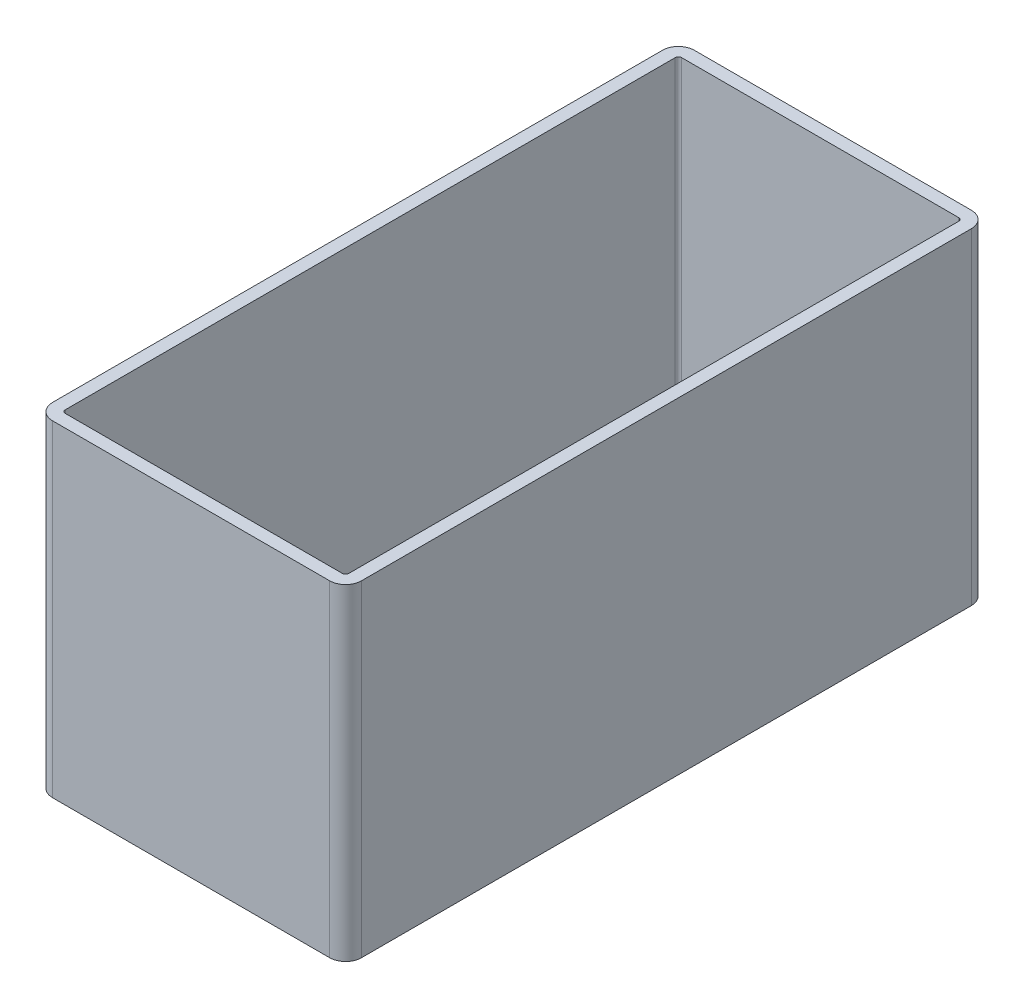
ISO-10303-21;
HEADER;
FILE_DESCRIPTION(('STEP AP214'),'2;1');
FILE_NAME('part.step','',(''),(''),'','','');
FILE_SCHEMA(('AUTOMOTIVE_DESIGN { 1 0 10303 214 1 1 1 1 }'));
ENDSEC;
DATA;
#1=APPLICATION_CONTEXT('core data for automotive mechanical design processes');
#2=APPLICATION_PROTOCOL_DEFINITION('international standard','automotive_design',2000,#1);
#3=PRODUCT_CONTEXT('',#1,'mechanical');
#4=PRODUCT('Part','Part','',(#3));
#5=PRODUCT_RELATED_PRODUCT_CATEGORY('part','',(#4));
#6=PRODUCT_DEFINITION_FORMATION('','',#4);
#7=PRODUCT_DEFINITION_CONTEXT('part definition',#1,'design');
#8=PRODUCT_DEFINITION('design','',#6,#7);
#9=PRODUCT_DEFINITION_SHAPE('','',#8);
#10=(LENGTH_UNIT() NAMED_UNIT(*) SI_UNIT(.MILLI.,.METRE.));
#11=(NAMED_UNIT(*) PLANE_ANGLE_UNIT() SI_UNIT($,.RADIAN.));
#12=(NAMED_UNIT(*) SI_UNIT($,.STERADIAN.) SOLID_ANGLE_UNIT());
#13=UNCERTAINTY_MEASURE_WITH_UNIT(LENGTH_MEASURE(1.E-05),#10,'distance_accuracy_value','');
#14=(GEOMETRIC_REPRESENTATION_CONTEXT(3) GLOBAL_UNCERTAINTY_ASSIGNED_CONTEXT((#13)) GLOBAL_UNIT_ASSIGNED_CONTEXT((#10,
#11,#12)) REPRESENTATION_CONTEXT('',''));
#15=CARTESIAN_POINT('',(0.,0.,0.));
#16=DIRECTION('',(0.,0.,1.));
#17=DIRECTION('',(1.,0.,0.));
#18=AXIS2_PLACEMENT_3D('',#15,#16,#17);
#19=CARTESIAN_POINT('',(9.7,10.25,-20.15));
#20=DIRECTION('',(-1.,0.,0.));
#21=DIRECTION('',(0.,0.,1.));
#22=AXIS2_PLACEMENT_3D('',#19,#20,#21);
#23=PLANE('',#22);
#24=DIRECTION('',(0.,0.,-1.));
#25=VECTOR('',#24,1.);
#26=CARTESIAN_POINT('',(9.7,-10.25,-20.15));
#27=LINE('',#26,#25);
#28=CARTESIAN_POINT('',(9.7,-10.25,19.15));
#29=VERTEX_POINT('',#28);
#30=CARTESIAN_POINT('',(9.7,-10.25,-19.15));
#31=VERTEX_POINT('',#30);
#32=EDGE_CURVE('E202',#29,#31,#27,.T.);
#33=ORIENTED_EDGE('',*,*,#32,.T.);
#34=DIRECTION('',(0.,-1.,0.));
#35=VECTOR('',#34,1.);
#36=CARTESIAN_POINT('',(9.7,10.25,-19.15));
#37=LINE('',#36,#35);
#38=CARTESIAN_POINT('',(9.7,10.25,-19.15));
#39=VERTEX_POINT('',#38);
#40=EDGE_CURVE('E266',#31,#39,#37,.F.);
#41=ORIENTED_EDGE('',*,*,#40,.T.);
#42=DIRECTION('',(0.,0.,-1.));
#43=VECTOR('',#42,1.);
#44=CARTESIAN_POINT('',(9.7,10.25,-20.15));
#45=LINE('',#44,#43);
#46=CARTESIAN_POINT('',(9.7,10.25,19.15));
#47=VERTEX_POINT('',#46);
#48=EDGE_CURVE('E214',#47,#39,#45,.T.);
#49=ORIENTED_EDGE('',*,*,#48,.F.);
#50=DIRECTION('',(0.,-1.,0.));
#51=VECTOR('',#50,1.);
#52=CARTESIAN_POINT('',(9.7,10.25,19.15));
#53=LINE('',#52,#51);
#54=EDGE_CURVE('E263',#47,#29,#53,.T.);
#55=ORIENTED_EDGE('',*,*,#54,.T.);
#56=EDGE_LOOP('',(#33,#41,#49,#55));
#57=FACE_BOUND('',#56,.T.);
#58=ADVANCED_FACE('F33',(#57),#23,.F.);
#59=CARTESIAN_POINT('',(-9.7,10.25,-20.15));
#60=DIRECTION('',(0.,0.,1.));
#61=DIRECTION('',(1.,0.,0.));
#62=AXIS2_PLACEMENT_3D('',#59,#60,#61);
#63=PLANE('',#62);
#64=DIRECTION('',(-1.,0.,0.));
#65=VECTOR('',#64,1.);
#66=CARTESIAN_POINT('',(-9.7,-10.25,-20.15));
#67=LINE('',#66,#65);
#68=CARTESIAN_POINT('',(8.7,-10.25,-20.15));
#69=VERTEX_POINT('',#68);
#70=CARTESIAN_POINT('',(-8.7,-10.25,-20.15));
#71=VERTEX_POINT('',#70);
#72=EDGE_CURVE('E230',#69,#71,#67,.T.);
#73=ORIENTED_EDGE('',*,*,#72,.T.);
#74=DIRECTION('',(0.,-1.,0.));
#75=VECTOR('',#74,1.);
#76=CARTESIAN_POINT('',(-8.7,10.25,-20.15));
#77=LINE('',#76,#75);
#78=CARTESIAN_POINT('',(-8.7,10.25,-20.15));
#79=VERTEX_POINT('',#78);
#80=EDGE_CURVE('E253',#71,#79,#77,.F.);
#81=ORIENTED_EDGE('',*,*,#80,.T.);
#82=DIRECTION('',(-1.,0.,0.));
#83=VECTOR('',#82,1.);
#84=CARTESIAN_POINT('',(-9.7,10.25,-20.15));
#85=LINE('',#84,#83);
#86=CARTESIAN_POINT('',(8.7,10.25,-20.15));
#87=VERTEX_POINT('',#86);
#88=EDGE_CURVE('E217',#87,#79,#85,.T.);
#89=ORIENTED_EDGE('',*,*,#88,.F.);
#90=DIRECTION('',(0.,-1.,0.));
#91=VECTOR('',#90,1.);
#92=CARTESIAN_POINT('',(8.7,10.25,-20.15));
#93=LINE('',#92,#91);
#94=EDGE_CURVE('E250',#87,#69,#93,.T.);
#95=ORIENTED_EDGE('',*,*,#94,.T.);
#96=EDGE_LOOP('',(#73,#81,#89,#95));
#97=FACE_BOUND('',#96,.T.);
#98=ADVANCED_FACE('F294',(#97),#63,.F.);
#99=CARTESIAN_POINT('',(-9.7,10.25,-20.15));
#100=DIRECTION('',(1.,0.,0.));
#101=DIRECTION('',(0.,0.,-1.));
#102=AXIS2_PLACEMENT_3D('',#99,#100,#101);
#103=PLANE('',#102);
#104=DIRECTION('',(0.,0.,1.));
#105=VECTOR('',#104,1.);
#106=CARTESIAN_POINT('',(-9.7,10.25,-20.15));
#107=LINE('',#106,#105);
#108=CARTESIAN_POINT('',(-9.7,10.25,-19.15));
#109=VERTEX_POINT('',#108);
#110=CARTESIAN_POINT('',(-9.69999999999999,10.25,19.15));
#111=VERTEX_POINT('',#110);
#112=EDGE_CURVE('E221',#109,#111,#107,.T.);
#113=ORIENTED_EDGE('',*,*,#112,.F.);
#114=DIRECTION('',(0.,-1.,0.));
#115=VECTOR('',#114,1.);
#116=CARTESIAN_POINT('',(-9.7,10.25,-19.15));
#117=LINE('',#116,#115);
#118=CARTESIAN_POINT('',(-9.7,-10.25,-19.15));
#119=VERTEX_POINT('',#118);
#120=EDGE_CURVE('E239',#109,#119,#117,.T.);
#121=ORIENTED_EDGE('',*,*,#120,.T.);
#122=DIRECTION('',(0.,0.,1.));
#123=VECTOR('',#122,1.);
#124=CARTESIAN_POINT('',(-9.7,-10.25,-20.15));
#125=LINE('',#124,#123);
#126=CARTESIAN_POINT('',(-9.69999999999999,-10.25,19.15));
#127=VERTEX_POINT('',#126);
#128=EDGE_CURVE('E233',#119,#127,#125,.T.);
#129=ORIENTED_EDGE('',*,*,#128,.T.);
#130=DIRECTION('',(0.,-1.,0.));
#131=VECTOR('',#130,1.);
#132=CARTESIAN_POINT('',(-9.69999999999999,10.25,19.15));
#133=LINE('',#132,#131);
#134=EDGE_CURVE('E227',#127,#111,#133,.F.);
#135=ORIENTED_EDGE('',*,*,#134,.T.);
#136=EDGE_LOOP('',(#113,#121,#129,#135));
#137=FACE_BOUND('',#136,.T.);
#138=ADVANCED_FACE('F302',(#137),#103,.F.);
#139=CARTESIAN_POINT('',(-9.69999999999999,10.25,20.15));
#140=DIRECTION('',(0.,0.,-1.));
#141=DIRECTION('',(-1.,0.,0.));
#142=AXIS2_PLACEMENT_3D('',#139,#140,#141);
#143=PLANE('',#142);
#144=DIRECTION('',(1.,0.,0.));
#145=VECTOR('',#144,1.);
#146=CARTESIAN_POINT('',(-9.69999999999999,-10.25,20.15));
#147=LINE('',#146,#145);
#148=CARTESIAN_POINT('',(-8.69999999999999,-10.25,20.15));
#149=VERTEX_POINT('',#148);
#150=CARTESIAN_POINT('',(8.7,-10.25,20.15));
#151=VERTEX_POINT('',#150);
#152=EDGE_CURVE('E218',#149,#151,#147,.T.);
#153=ORIENTED_EDGE('',*,*,#152,.T.);
#154=DIRECTION('',(0.,-1.,0.));
#155=VECTOR('',#154,1.);
#156=CARTESIAN_POINT('',(8.7,10.25,20.15));
#157=LINE('',#156,#155);
#158=CARTESIAN_POINT('',(8.7,10.25,20.15));
#159=VERTEX_POINT('',#158);
#160=EDGE_CURVE('E11',#151,#159,#157,.F.);
#161=ORIENTED_EDGE('',*,*,#160,.T.);
#162=DIRECTION('',(1.,0.,0.));
#163=VECTOR('',#162,1.);
#164=CARTESIAN_POINT('',(-9.69999999999999,10.25,20.15));
#165=LINE('',#164,#163);
#166=CARTESIAN_POINT('',(-8.69999999999999,10.25,20.15));
#167=VERTEX_POINT('',#166);
#168=EDGE_CURVE('E224',#167,#159,#165,.T.);
#169=ORIENTED_EDGE('',*,*,#168,.F.);
#170=DIRECTION('',(0.,-1.,0.));
#171=VECTOR('',#170,1.);
#172=CARTESIAN_POINT('',(-8.69999999999999,10.25,20.15));
#173=LINE('',#172,#171);
#174=EDGE_CURVE('E41',#167,#149,#173,.T.);
#175=ORIENTED_EDGE('',*,*,#174,.T.);
#176=EDGE_LOOP('',(#153,#161,#169,#175));
#177=FACE_BOUND('',#176,.T.);
#178=ADVANCED_FACE('F272',(#177),#143,.F.);
#179=CARTESIAN_POINT('',(0.,10.25,0.));
#180=DIRECTION('',(0.,1.,0.));
#181=DIRECTION('',(0.,0.,1.));
#182=AXIS2_PLACEMENT_3D('',#179,#180,#181);
#183=PLANE('',#182);
#184=CARTESIAN_POINT('',(8.7,10.25,-19.15));
#185=DIRECTION('',(0.,1.,0.));
#186=DIRECTION('',(0.,0.,1.));
#187=AXIS2_PLACEMENT_3D('',#184,#185,#186);
#188=CIRCLE('',#187,0.200000000000003);
#189=CARTESIAN_POINT('',(8.9,10.25,-19.15));
#190=VERTEX_POINT('',#189);
#191=CARTESIAN_POINT('',(8.7,10.25,-19.35));
#192=VERTEX_POINT('',#191);
#193=EDGE_CURVE('E48',#190,#192,#188,.T.);
#194=ORIENTED_EDGE('',*,*,#193,.F.);
#195=DIRECTION('',(0.,0.,-1.));
#196=VECTOR('',#195,1.);
#197=CARTESIAN_POINT('',(8.9,10.25,19.15));
#198=LINE('',#197,#196);
#199=CARTESIAN_POINT('',(8.90000000000001,10.25,19.15));
#200=VERTEX_POINT('',#199);
#201=EDGE_CURVE('E164',#200,#190,#198,.T.);
#202=ORIENTED_EDGE('',*,*,#201,.F.);
#203=CARTESIAN_POINT('',(8.7,10.25,19.15));
#204=DIRECTION('',(0.,1.,0.));
#205=DIRECTION('',(0.,0.,1.));
#206=AXIS2_PLACEMENT_3D('',#203,#204,#205);
#207=CIRCLE('',#206,0.200000000000001);
#208=CARTESIAN_POINT('',(8.7,10.25,19.35));
#209=VERTEX_POINT('',#208);
#210=EDGE_CURVE('E167',#209,#200,#207,.T.);
#211=ORIENTED_EDGE('',*,*,#210,.F.);
#212=DIRECTION('',(1.,0.,0.));
#213=VECTOR('',#212,1.);
#214=CARTESIAN_POINT('',(-8.69999999999999,10.25,19.35));
#215=LINE('',#214,#213);
#216=CARTESIAN_POINT('',(-8.69999999999999,10.25,19.35));
#217=VERTEX_POINT('',#216);
#218=EDGE_CURVE('E195',#217,#209,#215,.T.);
#219=ORIENTED_EDGE('',*,*,#218,.F.);
#220=CARTESIAN_POINT('',(-8.69999999999999,10.25,19.15));
#221=DIRECTION('',(0.,1.,0.));
#222=DIRECTION('',(0.,0.,1.));
#223=AXIS2_PLACEMENT_3D('',#220,#221,#222);
#224=CIRCLE('',#223,0.200000000000001);
#225=CARTESIAN_POINT('',(-8.89999999999999,10.25,19.15));
#226=VERTEX_POINT('',#225);
#227=EDGE_CURVE('E192',#226,#217,#224,.T.);
#228=ORIENTED_EDGE('',*,*,#227,.F.);
#229=DIRECTION('',(0.,0.,1.));
#230=VECTOR('',#229,1.);
#231=CARTESIAN_POINT('',(-8.9,10.25,-19.15));
#232=LINE('',#231,#230);
#233=CARTESIAN_POINT('',(-8.9,10.25,-19.15));
#234=VERTEX_POINT('',#233);
#235=EDGE_CURVE('E189',#234,#226,#232,.T.);
#236=ORIENTED_EDGE('',*,*,#235,.F.);
#237=CARTESIAN_POINT('',(-8.7,10.25,-19.15));
#238=DIRECTION('',(0.,1.,0.));
#239=DIRECTION('',(0.,0.,1.));
#240=AXIS2_PLACEMENT_3D('',#237,#238,#239);
#241=CIRCLE('',#240,0.2);
#242=CARTESIAN_POINT('',(-8.7,10.25,-19.35));
#243=VERTEX_POINT('',#242);
#244=EDGE_CURVE('E186',#243,#234,#241,.T.);
#245=ORIENTED_EDGE('',*,*,#244,.F.);
#246=DIRECTION('',(-1.,0.,0.));
#247=VECTOR('',#246,1.);
#248=CARTESIAN_POINT('',(8.7,10.25,-19.35));
#249=LINE('',#248,#247);
#250=EDGE_CURVE('E184',#192,#243,#249,.T.);
#251=ORIENTED_EDGE('',*,*,#250,.F.);
#252=EDGE_LOOP('',(#194,#202,#211,#219,#228,#236,#245,#251));
#253=FACE_BOUND('',#252,.T.);
#254=ORIENTED_EDGE('',*,*,#88,.T.);
#255=CARTESIAN_POINT('',(-8.7,10.25,-19.15));
#256=DIRECTION('',(0.,1.,0.));
#257=DIRECTION('',(0.,0.,1.));
#258=AXIS2_PLACEMENT_3D('',#255,#256,#257);
#259=CIRCLE('',#258,1.);
#260=EDGE_CURVE('E261',#79,#109,#259,.T.);
#261=ORIENTED_EDGE('',*,*,#260,.T.);
#262=ORIENTED_EDGE('',*,*,#112,.T.);
#263=CARTESIAN_POINT('',(-8.69999999999999,10.25,19.15));
#264=DIRECTION('',(0.,1.,0.));
#265=DIRECTION('',(0.,0.,1.));
#266=AXIS2_PLACEMENT_3D('',#263,#264,#265);
#267=CIRCLE('',#266,1.);
#268=EDGE_CURVE('E255',#111,#167,#267,.T.);
#269=ORIENTED_EDGE('',*,*,#268,.T.);
#270=ORIENTED_EDGE('',*,*,#168,.T.);
#271=CARTESIAN_POINT('',(8.7,10.25,19.15));
#272=DIRECTION('',(0.,1.,0.));
#273=DIRECTION('',(0.,0.,1.));
#274=AXIS2_PLACEMENT_3D('',#271,#272,#273);
#275=CIRCLE('',#274,1.);
#276=EDGE_CURVE('E257',#159,#47,#275,.T.);
#277=ORIENTED_EDGE('',*,*,#276,.T.);
#278=ORIENTED_EDGE('',*,*,#48,.T.);
#279=CARTESIAN_POINT('',(8.7,10.25,-19.15));
#280=DIRECTION('',(0.,1.,0.));
#281=DIRECTION('',(0.,0.,1.));
#282=AXIS2_PLACEMENT_3D('',#279,#280,#281);
#283=CIRCLE('',#282,1.);
#284=EDGE_CURVE('E259',#39,#87,#283,.T.);
#285=ORIENTED_EDGE('',*,*,#284,.T.);
#286=EDGE_LOOP('',(#254,#261,#262,#269,#270,#277,#278,#285));
#287=FACE_BOUND('',#286,.T.);
#288=ADVANCED_FACE('F287',(#253,#287),#183,.T.);
#289=CARTESIAN_POINT('',(0.,-10.25,0.));
#290=DIRECTION('',(0.,1.,0.));
#291=DIRECTION('',(0.,0.,1.));
#292=AXIS2_PLACEMENT_3D('',#289,#290,#291);
#293=PLANE('',#292);
#294=DIRECTION('',(0.,0.,-1.));
#295=VECTOR('',#294,1.);
#296=CARTESIAN_POINT('',(8.9,-10.25,19.15));
#297=LINE('',#296,#295);
#298=CARTESIAN_POINT('',(8.90000000000001,-10.25,19.15));
#299=VERTEX_POINT('',#298);
#300=CARTESIAN_POINT('',(8.9,-10.25,-19.15));
#301=VERTEX_POINT('',#300);
#302=EDGE_CURVE('E153',#299,#301,#297,.T.);
#303=ORIENTED_EDGE('',*,*,#302,.T.);
#304=CARTESIAN_POINT('',(8.7,-10.25,-19.15));
#305=DIRECTION('',(0.,1.,0.));
#306=DIRECTION('',(0.,0.,1.));
#307=AXIS2_PLACEMENT_3D('',#304,#305,#306);
#308=CIRCLE('',#307,0.200000000000003);
#309=CARTESIAN_POINT('',(8.7,-10.25,-19.35));
#310=VERTEX_POINT('',#309);
#311=EDGE_CURVE('E147',#301,#310,#308,.T.);
#312=ORIENTED_EDGE('',*,*,#311,.T.);
#313=DIRECTION('',(-1.,0.,0.));
#314=VECTOR('',#313,1.);
#315=CARTESIAN_POINT('',(8.7,-10.25,-19.35));
#316=LINE('',#315,#314);
#317=CARTESIAN_POINT('',(-8.7,-10.25,-19.35));
#318=VERTEX_POINT('',#317);
#319=EDGE_CURVE('E156',#310,#318,#316,.T.);
#320=ORIENTED_EDGE('',*,*,#319,.T.);
#321=CARTESIAN_POINT('',(-8.7,-10.25,-19.15));
#322=DIRECTION('',(0.,1.,0.));
#323=DIRECTION('',(0.,0.,1.));
#324=AXIS2_PLACEMENT_3D('',#321,#322,#323);
#325=CIRCLE('',#324,0.2);
#326=CARTESIAN_POINT('',(-8.9,-10.25,-19.15));
#327=VERTEX_POINT('',#326);
#328=EDGE_CURVE('E56',#318,#327,#325,.T.);
#329=ORIENTED_EDGE('',*,*,#328,.T.);
#330=DIRECTION('',(0.,0.,1.));
#331=VECTOR('',#330,1.);
#332=CARTESIAN_POINT('',(-8.9,-10.25,-19.15));
#333=LINE('',#332,#331);
#334=CARTESIAN_POINT('',(-8.89999999999999,-10.25,19.15));
#335=VERTEX_POINT('',#334);
#336=EDGE_CURVE('E171',#327,#335,#333,.T.);
#337=ORIENTED_EDGE('',*,*,#336,.T.);
#338=CARTESIAN_POINT('',(-8.69999999999999,-10.25,19.15));
#339=DIRECTION('',(0.,1.,0.));
#340=DIRECTION('',(0.,0.,1.));
#341=AXIS2_PLACEMENT_3D('',#338,#339,#340);
#342=CIRCLE('',#341,0.200000000000001);
#343=CARTESIAN_POINT('',(-8.69999999999999,-10.25,19.35));
#344=VERTEX_POINT('',#343);
#345=EDGE_CURVE('E174',#335,#344,#342,.T.);
#346=ORIENTED_EDGE('',*,*,#345,.T.);
#347=DIRECTION('',(1.,0.,0.));
#348=VECTOR('',#347,1.);
#349=CARTESIAN_POINT('',(-8.69999999999999,-10.25,19.35));
#350=LINE('',#349,#348);
#351=CARTESIAN_POINT('',(8.7,-10.25,19.35));
#352=VERTEX_POINT('',#351);
#353=EDGE_CURVE('E177',#344,#352,#350,.T.);
#354=ORIENTED_EDGE('',*,*,#353,.T.);
#355=CARTESIAN_POINT('',(8.7,-10.25,19.15));
#356=DIRECTION('',(0.,1.,0.));
#357=DIRECTION('',(0.,0.,1.));
#358=AXIS2_PLACEMENT_3D('',#355,#356,#357);
#359=CIRCLE('',#358,0.200000000000001);
#360=EDGE_CURVE('E180',#352,#299,#359,.T.);
#361=ORIENTED_EDGE('',*,*,#360,.T.);
#362=EDGE_LOOP('',(#303,#312,#320,#329,#337,#346,#354,#361));
#363=FACE_BOUND('',#362,.T.);
#364=ORIENTED_EDGE('',*,*,#128,.F.);
#365=CARTESIAN_POINT('',(-8.7,-10.25,-19.15));
#366=DIRECTION('',(0.,1.,0.));
#367=DIRECTION('',(0.,0.,1.));
#368=AXIS2_PLACEMENT_3D('',#365,#366,#367);
#369=CIRCLE('',#368,1.);
#370=EDGE_CURVE('E248',#119,#71,#369,.F.);
#371=ORIENTED_EDGE('',*,*,#370,.T.);
#372=ORIENTED_EDGE('',*,*,#72,.F.);
#373=CARTESIAN_POINT('',(8.7,-10.25,-19.15));
#374=DIRECTION('',(0.,1.,0.));
#375=DIRECTION('',(0.,0.,1.));
#376=AXIS2_PLACEMENT_3D('',#373,#374,#375);
#377=CIRCLE('',#376,1.);
#378=EDGE_CURVE('E246',#69,#31,#377,.F.);
#379=ORIENTED_EDGE('',*,*,#378,.T.);
#380=ORIENTED_EDGE('',*,*,#32,.F.);
#381=CARTESIAN_POINT('',(8.7,-10.25,19.15));
#382=DIRECTION('',(0.,1.,0.));
#383=DIRECTION('',(0.,0.,1.));
#384=AXIS2_PLACEMENT_3D('',#381,#382,#383);
#385=CIRCLE('',#384,1.);
#386=EDGE_CURVE('E244',#29,#151,#385,.F.);
#387=ORIENTED_EDGE('',*,*,#386,.T.);
#388=ORIENTED_EDGE('',*,*,#152,.F.);
#389=CARTESIAN_POINT('',(-8.69999999999999,-10.25,19.15));
#390=DIRECTION('',(0.,1.,0.));
#391=DIRECTION('',(0.,0.,1.));
#392=AXIS2_PLACEMENT_3D('',#389,#390,#391);
#393=CIRCLE('',#392,1.);
#394=EDGE_CURVE('E242',#149,#127,#393,.F.);
#395=ORIENTED_EDGE('',*,*,#394,.T.);
#396=EDGE_LOOP('',(#364,#371,#372,#379,#380,#387,#388,#395));
#397=FACE_BOUND('',#396,.T.);
#398=ADVANCED_FACE('F160',(#363,#397),#293,.F.);
#399=CARTESIAN_POINT('',(-8.7,10.25,-19.15));
#400=DIRECTION('',(0.,-1.,0.));
#401=DIRECTION('',(0.,0.,-1.));
#402=AXIS2_PLACEMENT_3D('',#399,#400,#401);
#403=CYLINDRICAL_SURFACE('',#402,1.);
#404=ORIENTED_EDGE('',*,*,#260,.F.);
#405=ORIENTED_EDGE('',*,*,#80,.F.);
#406=ORIENTED_EDGE('',*,*,#370,.F.);
#407=ORIENTED_EDGE('',*,*,#120,.F.);
#408=EDGE_LOOP('',(#404,#405,#406,#407));
#409=FACE_BOUND('',#408,.T.);
#410=ADVANCED_FACE('F299',(#409),#403,.T.);
#411=CARTESIAN_POINT('',(8.7,10.25,-19.15));
#412=DIRECTION('',(0.,-1.,0.));
#413=DIRECTION('',(0.,0.,-1.));
#414=AXIS2_PLACEMENT_3D('',#411,#412,#413);
#415=CYLINDRICAL_SURFACE('',#414,1.);
#416=ORIENTED_EDGE('',*,*,#284,.F.);
#417=ORIENTED_EDGE('',*,*,#40,.F.);
#418=ORIENTED_EDGE('',*,*,#378,.F.);
#419=ORIENTED_EDGE('',*,*,#94,.F.);
#420=EDGE_LOOP('',(#416,#417,#418,#419));
#421=FACE_BOUND('',#420,.T.);
#422=ADVANCED_FACE('F291',(#421),#415,.T.);
#423=CARTESIAN_POINT('',(8.7,10.25,19.15));
#424=DIRECTION('',(0.,-1.,0.));
#425=DIRECTION('',(0.,0.,-1.));
#426=AXIS2_PLACEMENT_3D('',#423,#424,#425);
#427=CYLINDRICAL_SURFACE('',#426,1.);
#428=ORIENTED_EDGE('',*,*,#276,.F.);
#429=ORIENTED_EDGE('',*,*,#160,.F.);
#430=ORIENTED_EDGE('',*,*,#386,.F.);
#431=ORIENTED_EDGE('',*,*,#54,.F.);
#432=EDGE_LOOP('',(#428,#429,#430,#431));
#433=FACE_BOUND('',#432,.T.);
#434=ADVANCED_FACE('F281',(#433),#427,.T.);
#435=CARTESIAN_POINT('',(-8.69999999999999,10.25,19.15));
#436=DIRECTION('',(0.,-1.,0.));
#437=DIRECTION('',(0.,0.,-1.));
#438=AXIS2_PLACEMENT_3D('',#435,#436,#437);
#439=CYLINDRICAL_SURFACE('',#438,1.);
#440=ORIENTED_EDGE('',*,*,#268,.F.);
#441=ORIENTED_EDGE('',*,*,#134,.F.);
#442=ORIENTED_EDGE('',*,*,#394,.F.);
#443=ORIENTED_EDGE('',*,*,#174,.F.);
#444=EDGE_LOOP('',(#440,#441,#442,#443));
#445=FACE_BOUND('',#444,.T.);
#446=ADVANCED_FACE('F35',(#445),#439,.T.);
#447=CARTESIAN_POINT('',(8.7,-10.25,-19.15));
#448=DIRECTION('',(0.,1.,0.));
#449=DIRECTION('',(0.,0.,1.));
#450=AXIS2_PLACEMENT_3D('',#447,#448,#449);
#451=CYLINDRICAL_SURFACE('',#450,0.200000000000003);
#452=ORIENTED_EDGE('',*,*,#193,.T.);
#453=DIRECTION('',(0.,1.,0.));
#454=VECTOR('',#453,1.);
#455=CARTESIAN_POINT('',(8.7,-10.25,-19.35));
#456=LINE('',#455,#454);
#457=EDGE_CURVE('E143',#310,#192,#456,.T.);
#458=ORIENTED_EDGE('',*,*,#457,.F.);
#459=ORIENTED_EDGE('',*,*,#311,.F.);
#460=DIRECTION('',(0.,1.,0.));
#461=VECTOR('',#460,1.);
#462=CARTESIAN_POINT('',(8.9,-10.25,-19.15));
#463=LINE('',#462,#461);
#464=EDGE_CURVE('E200',#301,#190,#463,.T.);
#465=ORIENTED_EDGE('',*,*,#464,.T.);
#466=EDGE_LOOP('',(#452,#458,#459,#465));
#467=FACE_BOUND('',#466,.T.);
#468=ADVANCED_FACE('F145',(#467),#451,.F.);
#469=CARTESIAN_POINT('',(8.9,-10.25,19.15));
#470=DIRECTION('',(1.,0.,0.));
#471=DIRECTION('',(0.,0.,-1.));
#472=AXIS2_PLACEMENT_3D('',#469,#470,#471);
#473=PLANE('',#472);
#474=ORIENTED_EDGE('',*,*,#201,.T.);
#475=ORIENTED_EDGE('',*,*,#464,.F.);
#476=ORIENTED_EDGE('',*,*,#302,.F.);
#477=DIRECTION('',(0.,1.,0.));
#478=VECTOR('',#477,1.);
#479=CARTESIAN_POINT('',(8.90000000000001,-10.25,19.15));
#480=LINE('',#479,#478);
#481=EDGE_CURVE('E203',#299,#200,#480,.T.);
#482=ORIENTED_EDGE('',*,*,#481,.T.);
#483=EDGE_LOOP('',(#474,#475,#476,#482));
#484=FACE_BOUND('',#483,.T.);
#485=ADVANCED_FACE('F309',(#484),#473,.F.);
#486=CARTESIAN_POINT('',(8.7,-10.25,19.15));
#487=DIRECTION('',(0.,1.,0.));
#488=DIRECTION('',(0.,0.,1.));
#489=AXIS2_PLACEMENT_3D('',#486,#487,#488);
#490=CYLINDRICAL_SURFACE('',#489,0.200000000000001);
#491=ORIENTED_EDGE('',*,*,#210,.T.);
#492=ORIENTED_EDGE('',*,*,#481,.F.);
#493=ORIENTED_EDGE('',*,*,#360,.F.);
#494=DIRECTION('',(0.,1.,0.));
#495=VECTOR('',#494,1.);
#496=CARTESIAN_POINT('',(8.7,-10.25,19.35));
#497=LINE('',#496,#495);
#498=EDGE_CURVE('E205',#352,#209,#497,.T.);
#499=ORIENTED_EDGE('',*,*,#498,.T.);
#500=EDGE_LOOP('',(#491,#492,#493,#499));
#501=FACE_BOUND('',#500,.T.);
#502=ADVANCED_FACE('F369',(#501),#490,.F.);
#503=CARTESIAN_POINT('',(-8.69999999999999,-10.25,19.35));
#504=DIRECTION('',(0.,0.,1.));
#505=DIRECTION('',(1.,0.,0.));
#506=AXIS2_PLACEMENT_3D('',#503,#504,#505);
#507=PLANE('',#506);
#508=ORIENTED_EDGE('',*,*,#218,.T.);
#509=ORIENTED_EDGE('',*,*,#498,.F.);
#510=ORIENTED_EDGE('',*,*,#353,.F.);
#511=DIRECTION('',(0.,1.,0.));
#512=VECTOR('',#511,1.);
#513=CARTESIAN_POINT('',(-8.69999999999999,-10.25,19.35));
#514=LINE('',#513,#512);
#515=EDGE_CURVE('E207',#344,#217,#514,.T.);
#516=ORIENTED_EDGE('',*,*,#515,.T.);
#517=EDGE_LOOP('',(#508,#509,#510,#516));
#518=FACE_BOUND('',#517,.T.);
#519=ADVANCED_FACE('F379',(#518),#507,.F.);
#520=CARTESIAN_POINT('',(-8.69999999999999,-10.25,19.15));
#521=DIRECTION('',(0.,1.,0.));
#522=DIRECTION('',(0.,0.,1.));
#523=AXIS2_PLACEMENT_3D('',#520,#521,#522);
#524=CYLINDRICAL_SURFACE('',#523,0.200000000000001);
#525=ORIENTED_EDGE('',*,*,#227,.T.);
#526=ORIENTED_EDGE('',*,*,#515,.F.);
#527=ORIENTED_EDGE('',*,*,#345,.F.);
#528=DIRECTION('',(0.,1.,0.));
#529=VECTOR('',#528,1.);
#530=CARTESIAN_POINT('',(-8.89999999999999,-10.25,19.15));
#531=LINE('',#530,#529);
#532=EDGE_CURVE('E209',#335,#226,#531,.T.);
#533=ORIENTED_EDGE('',*,*,#532,.T.);
#534=EDGE_LOOP('',(#525,#526,#527,#533));
#535=FACE_BOUND('',#534,.T.);
#536=ADVANCED_FACE('F389',(#535),#524,.F.);
#537=CARTESIAN_POINT('',(-8.9,-10.25,-19.15));
#538=DIRECTION('',(-1.,0.,0.));
#539=DIRECTION('',(0.,0.,1.));
#540=AXIS2_PLACEMENT_3D('',#537,#538,#539);
#541=PLANE('',#540);
#542=ORIENTED_EDGE('',*,*,#235,.T.);
#543=ORIENTED_EDGE('',*,*,#532,.F.);
#544=ORIENTED_EDGE('',*,*,#336,.F.);
#545=DIRECTION('',(0.,1.,0.));
#546=VECTOR('',#545,1.);
#547=CARTESIAN_POINT('',(-8.9,-10.25,-19.15));
#548=LINE('',#547,#546);
#549=EDGE_CURVE('E211',#327,#234,#548,.T.);
#550=ORIENTED_EDGE('',*,*,#549,.T.);
#551=EDGE_LOOP('',(#542,#543,#544,#550));
#552=FACE_BOUND('',#551,.T.);
#553=ADVANCED_FACE('F399',(#552),#541,.F.);
#554=CARTESIAN_POINT('',(-8.7,-10.25,-19.15));
#555=DIRECTION('',(0.,1.,0.));
#556=DIRECTION('',(0.,0.,1.));
#557=AXIS2_PLACEMENT_3D('',#554,#555,#556);
#558=CYLINDRICAL_SURFACE('',#557,0.2);
#559=ORIENTED_EDGE('',*,*,#244,.T.);
#560=ORIENTED_EDGE('',*,*,#549,.F.);
#561=ORIENTED_EDGE('',*,*,#328,.F.);
#562=DIRECTION('',(0.,1.,0.));
#563=VECTOR('',#562,1.);
#564=CARTESIAN_POINT('',(-8.7,-10.25,-19.35));
#565=LINE('',#564,#563);
#566=EDGE_CURVE('E152',#318,#243,#565,.T.);
#567=ORIENTED_EDGE('',*,*,#566,.T.);
#568=EDGE_LOOP('',(#559,#560,#561,#567));
#569=FACE_BOUND('',#568,.T.);
#570=ADVANCED_FACE('F409',(#569),#558,.F.);
#571=CARTESIAN_POINT('',(8.7,-10.25,-19.35));
#572=DIRECTION('',(0.,0.,-1.));
#573=DIRECTION('',(-1.,0.,0.));
#574=AXIS2_PLACEMENT_3D('',#571,#572,#573);
#575=PLANE('',#574);
#576=ORIENTED_EDGE('',*,*,#250,.T.);
#577=ORIENTED_EDGE('',*,*,#566,.F.);
#578=ORIENTED_EDGE('',*,*,#319,.F.);
#579=ORIENTED_EDGE('',*,*,#457,.T.);
#580=EDGE_LOOP('',(#576,#577,#578,#579));
#581=FACE_BOUND('',#580,.T.);
#582=ADVANCED_FACE('F157',(#581),#575,.F.);
#583=CLOSED_SHELL('',(#58,#98,#138,#178,#288,#398,#410,#422,#434,#446,#468,#485,#502,#519,#536,
#553,#570,#582));
#584=MANIFOLD_SOLID_BREP('B2',#583);
#585=ADVANCED_BREP_SHAPE_REPRESENTATION('',(#18,#584),#14);
#586=SHAPE_DEFINITION_REPRESENTATION(#9,#585);
ENDSEC;
END-ISO-10303-21;
